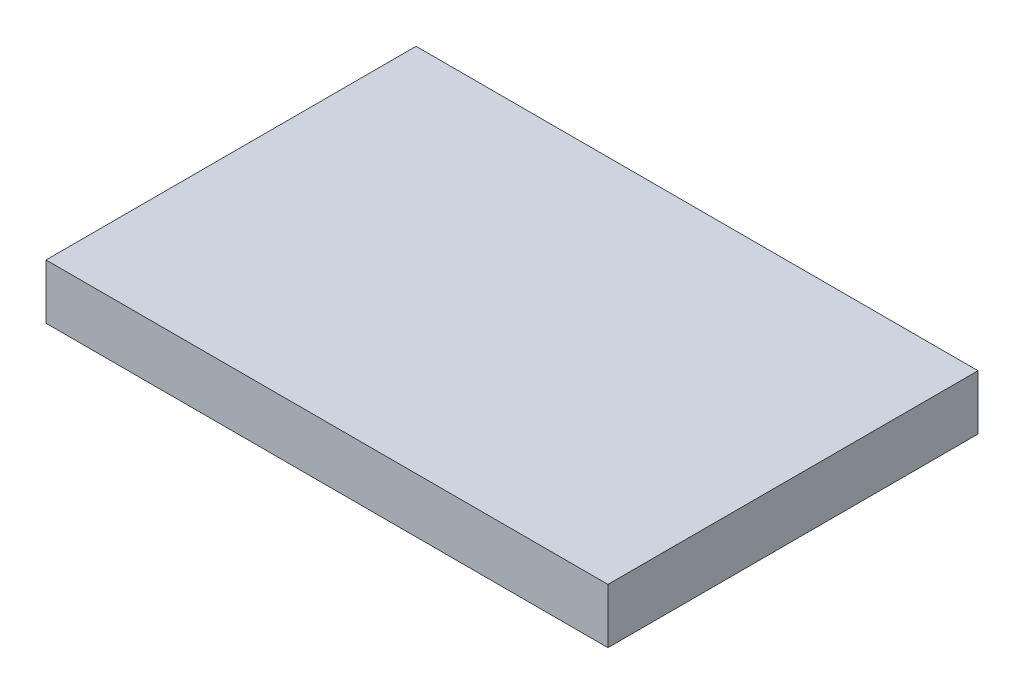
ISO-10303-21;
HEADER;
FILE_DESCRIPTION(('STEP AP214'),'2;1');
FILE_NAME('part.step','',(''),(''),'','','');
FILE_SCHEMA(('AUTOMOTIVE_DESIGN { 1 0 10303 214 1 1 1 1 }'));
ENDSEC;
DATA;
#1=APPLICATION_CONTEXT('core data for automotive mechanical design processes');
#2=APPLICATION_PROTOCOL_DEFINITION('international standard','automotive_design',2000,#1);
#3=PRODUCT_CONTEXT('',#1,'mechanical');
#4=PRODUCT('Part','Part','',(#3));
#5=PRODUCT_RELATED_PRODUCT_CATEGORY('part','',(#4));
#6=PRODUCT_DEFINITION_FORMATION('','',#4);
#7=PRODUCT_DEFINITION_CONTEXT('part definition',#1,'design');
#8=PRODUCT_DEFINITION('design','',#6,#7);
#9=PRODUCT_DEFINITION_SHAPE('','',#8);
#10=(LENGTH_UNIT() NAMED_UNIT(*) SI_UNIT(.MILLI.,.METRE.));
#11=(NAMED_UNIT(*) PLANE_ANGLE_UNIT() SI_UNIT($,.RADIAN.));
#12=(NAMED_UNIT(*) SI_UNIT($,.STERADIAN.) SOLID_ANGLE_UNIT());
#13=UNCERTAINTY_MEASURE_WITH_UNIT(LENGTH_MEASURE(1.E-05),#10,'distance_accuracy_value','');
#14=(GEOMETRIC_REPRESENTATION_CONTEXT(3) GLOBAL_UNCERTAINTY_ASSIGNED_CONTEXT((#13)) GLOBAL_UNIT_ASSIGNED_CONTEXT((#10,
#11,#12)) REPRESENTATION_CONTEXT('',''));
#15=CARTESIAN_POINT('',(0.,0.,0.));
#16=DIRECTION('',(0.,0.,1.));
#17=DIRECTION('',(1.,0.,0.));
#18=AXIS2_PLACEMENT_3D('',#15,#16,#17);
#19=CARTESIAN_POINT('',(41.,8.,27.));
#20=DIRECTION('',(-1.,0.,0.));
#21=DIRECTION('',(0.,0.,1.));
#22=AXIS2_PLACEMENT_3D('',#19,#20,#21);
#23=PLANE('',#22);
#24=DIRECTION('',(0.,0.,-1.));
#25=VECTOR('',#24,1.);
#26=CARTESIAN_POINT('',(41.,0.,27.));
#27=LINE('',#26,#25);
#28=CARTESIAN_POINT('',(41.,0.,27.));
#29=VERTEX_POINT('',#28);
#30=CARTESIAN_POINT('',(41.,0.,-27.));
#31=VERTEX_POINT('',#30);
#32=EDGE_CURVE('E111',#29,#31,#27,.T.);
#33=ORIENTED_EDGE('',*,*,#32,.T.);
#34=DIRECTION('',(0.,-1.,0.));
#35=VECTOR('',#34,1.);
#36=CARTESIAN_POINT('',(41.,8.,-27.));
#37=LINE('',#36,#35);
#38=CARTESIAN_POINT('',(41.,8.,-27.));
#39=VERTEX_POINT('',#38);
#40=EDGE_CURVE('E11',#39,#31,#37,.T.);
#41=ORIENTED_EDGE('',*,*,#40,.F.);
#42=DIRECTION('',(0.,0.,-1.));
#43=VECTOR('',#42,1.);
#44=CARTESIAN_POINT('',(41.,8.,27.));
#45=LINE('',#44,#43);
#46=CARTESIAN_POINT('',(41.,8.,27.));
#47=VERTEX_POINT('',#46);
#48=EDGE_CURVE('E100',#47,#39,#45,.T.);
#49=ORIENTED_EDGE('',*,*,#48,.F.);
#50=DIRECTION('',(0.,-1.,0.));
#51=VECTOR('',#50,1.);
#52=CARTESIAN_POINT('',(41.,8.,27.));
#53=LINE('',#52,#51);
#54=EDGE_CURVE('E106',#47,#29,#53,.T.);
#55=ORIENTED_EDGE('',*,*,#54,.T.);
#56=EDGE_LOOP('',(#33,#41,#49,#55));
#57=FACE_BOUND('',#56,.T.);
#58=ADVANCED_FACE('F44',(#57),#23,.F.);
#59=CARTESIAN_POINT('',(-41.,8.,-27.));
#60=DIRECTION('',(0.,0.,1.));
#61=DIRECTION('',(1.,0.,0.));
#62=AXIS2_PLACEMENT_3D('',#59,#60,#61);
#63=PLANE('',#62);
#64=DIRECTION('',(-1.,0.,0.));
#65=VECTOR('',#64,1.);
#66=CARTESIAN_POINT('',(-41.,0.,-27.));
#67=LINE('',#66,#65);
#68=CARTESIAN_POINT('',(-41.,0.,-27.));
#69=VERTEX_POINT('',#68);
#70=EDGE_CURVE('E105',#31,#69,#67,.T.);
#71=ORIENTED_EDGE('',*,*,#70,.T.);
#72=DIRECTION('',(0.,-1.,0.));
#73=VECTOR('',#72,1.);
#74=CARTESIAN_POINT('',(-41.,8.,-27.));
#75=LINE('',#74,#73);
#76=CARTESIAN_POINT('',(-41.,8.,-27.));
#77=VERTEX_POINT('',#76);
#78=EDGE_CURVE('E53',#77,#69,#75,.T.);
#79=ORIENTED_EDGE('',*,*,#78,.F.);
#80=DIRECTION('',(-1.,0.,0.));
#81=VECTOR('',#80,1.);
#82=CARTESIAN_POINT('',(-41.,8.,-27.));
#83=LINE('',#82,#81);
#84=EDGE_CURVE('E95',#39,#77,#83,.T.);
#85=ORIENTED_EDGE('',*,*,#84,.F.);
#86=ORIENTED_EDGE('',*,*,#40,.T.);
#87=EDGE_LOOP('',(#71,#79,#85,#86));
#88=FACE_BOUND('',#87,.T.);
#89=ADVANCED_FACE('F102',(#88),#63,.F.);
#90=CARTESIAN_POINT('',(-41.,8.,27.));
#91=DIRECTION('',(1.,0.,0.));
#92=DIRECTION('',(0.,0.,-1.));
#93=AXIS2_PLACEMENT_3D('',#90,#91,#92);
#94=PLANE('',#93);
#95=DIRECTION('',(0.,0.,1.));
#96=VECTOR('',#95,1.);
#97=CARTESIAN_POINT('',(-41.,0.,27.));
#98=LINE('',#97,#96);
#99=CARTESIAN_POINT('',(-41.,0.,27.));
#100=VERTEX_POINT('',#99);
#101=EDGE_CURVE('E80',#69,#100,#98,.T.);
#102=ORIENTED_EDGE('',*,*,#101,.T.);
#103=DIRECTION('',(0.,-1.,0.));
#104=VECTOR('',#103,1.);
#105=CARTESIAN_POINT('',(-41.,8.,27.));
#106=LINE('',#105,#104);
#107=CARTESIAN_POINT('',(-41.,8.,27.));
#108=VERTEX_POINT('',#107);
#109=EDGE_CURVE('E101',#108,#100,#106,.T.);
#110=ORIENTED_EDGE('',*,*,#109,.F.);
#111=DIRECTION('',(0.,0.,1.));
#112=VECTOR('',#111,1.);
#113=CARTESIAN_POINT('',(-41.,8.,27.));
#114=LINE('',#113,#112);
#115=EDGE_CURVE('E94',#77,#108,#114,.T.);
#116=ORIENTED_EDGE('',*,*,#115,.F.);
#117=ORIENTED_EDGE('',*,*,#78,.T.);
#118=EDGE_LOOP('',(#102,#110,#116,#117));
#119=FACE_BOUND('',#118,.T.);
#120=ADVANCED_FACE('F103',(#119),#94,.F.);
#121=CARTESIAN_POINT('',(-41.,8.,27.));
#122=DIRECTION('',(0.,0.,-1.));
#123=DIRECTION('',(-1.,0.,0.));
#124=AXIS2_PLACEMENT_3D('',#121,#122,#123);
#125=PLANE('',#124);
#126=DIRECTION('',(1.,0.,0.));
#127=VECTOR('',#126,1.);
#128=CARTESIAN_POINT('',(-41.,0.,27.));
#129=LINE('',#128,#127);
#130=EDGE_CURVE('E82',#100,#29,#129,.T.);
#131=ORIENTED_EDGE('',*,*,#130,.T.);
#132=ORIENTED_EDGE('',*,*,#54,.F.);
#133=DIRECTION('',(1.,0.,0.));
#134=VECTOR('',#133,1.);
#135=CARTESIAN_POINT('',(-41.,8.,27.));
#136=LINE('',#135,#134);
#137=EDGE_CURVE('E64',#108,#47,#136,.T.);
#138=ORIENTED_EDGE('',*,*,#137,.F.);
#139=ORIENTED_EDGE('',*,*,#109,.T.);
#140=EDGE_LOOP('',(#131,#132,#138,#139));
#141=FACE_BOUND('',#140,.T.);
#142=ADVANCED_FACE('F128',(#141),#125,.F.);
#143=CARTESIAN_POINT('',(0.,8.,0.));
#144=DIRECTION('',(0.,-1.,0.));
#145=DIRECTION('',(0.,0.,-1.));
#146=AXIS2_PLACEMENT_3D('',#143,#144,#145);
#147=PLANE('',#146);
#148=ORIENTED_EDGE('',*,*,#48,.T.);
#149=ORIENTED_EDGE('',*,*,#84,.T.);
#150=ORIENTED_EDGE('',*,*,#115,.T.);
#151=ORIENTED_EDGE('',*,*,#137,.T.);
#152=EDGE_LOOP('',(#148,#149,#150,#151));
#153=FACE_BOUND('',#152,.T.);
#154=ADVANCED_FACE('F93',(#153),#147,.F.);
#155=CARTESIAN_POINT('',(0.,0.,0.));
#156=DIRECTION('',(0.,-1.,0.));
#157=DIRECTION('',(0.,0.,-1.));
#158=AXIS2_PLACEMENT_3D('',#155,#156,#157);
#159=PLANE('',#158);
#160=ORIENTED_EDGE('',*,*,#32,.F.);
#161=ORIENTED_EDGE('',*,*,#130,.F.);
#162=ORIENTED_EDGE('',*,*,#101,.F.);
#163=ORIENTED_EDGE('',*,*,#70,.F.);
#164=EDGE_LOOP('',(#160,#161,#162,#163));
#165=FACE_BOUND('',#164,.T.);
#166=ADVANCED_FACE('F129',(#165),#159,.T.);
#167=CLOSED_SHELL('',(#58,#89,#120,#142,#154,#166));
#168=MANIFOLD_SOLID_BREP('B2',#167);
#169=ADVANCED_BREP_SHAPE_REPRESENTATION('',(#18,#168),#14);
#170=SHAPE_DEFINITION_REPRESENTATION(#9,#169);
ENDSEC;
END-ISO-10303-21;
